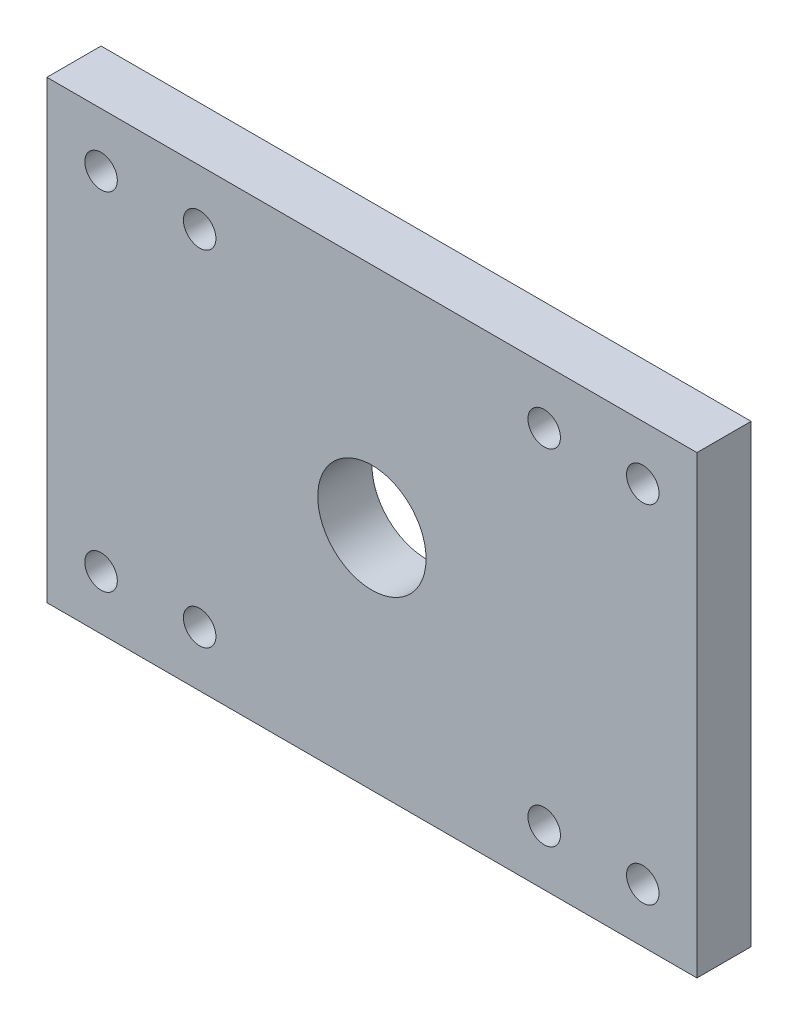
ISO-10303-21;
HEADER;
FILE_DESCRIPTION(('STEP AP214'),'2;1');
FILE_NAME('part.step','',(''),(''),'','','');
FILE_SCHEMA(('AUTOMOTIVE_DESIGN { 1 0 10303 214 1 1 1 1 }'));
ENDSEC;
DATA;
#1=APPLICATION_CONTEXT('core data for automotive mechanical design processes');
#2=APPLICATION_PROTOCOL_DEFINITION('international standard','automotive_design',2000,#1);
#3=PRODUCT_CONTEXT('',#1,'mechanical');
#4=PRODUCT('Part','Part','',(#3));
#5=PRODUCT_RELATED_PRODUCT_CATEGORY('part','',(#4));
#6=PRODUCT_DEFINITION_FORMATION('','',#4);
#7=PRODUCT_DEFINITION_CONTEXT('part definition',#1,'design');
#8=PRODUCT_DEFINITION('design','',#6,#7);
#9=PRODUCT_DEFINITION_SHAPE('','',#8);
#10=(LENGTH_UNIT() NAMED_UNIT(*) SI_UNIT(.MILLI.,.METRE.));
#11=(NAMED_UNIT(*) PLANE_ANGLE_UNIT() SI_UNIT($,.RADIAN.));
#12=(NAMED_UNIT(*) SI_UNIT($,.STERADIAN.) SOLID_ANGLE_UNIT());
#13=UNCERTAINTY_MEASURE_WITH_UNIT(LENGTH_MEASURE(1.E-05),#10,'distance_accuracy_value','');
#14=(GEOMETRIC_REPRESENTATION_CONTEXT(3) GLOBAL_UNCERTAINTY_ASSIGNED_CONTEXT((#13)) GLOBAL_UNIT_ASSIGNED_CONTEXT((#10,
#11,#12)) REPRESENTATION_CONTEXT('',''));
#15=CARTESIAN_POINT('',(0.,0.,0.));
#16=DIRECTION('',(0.,0.,1.));
#17=DIRECTION('',(1.,0.,0.));
#18=AXIS2_PLACEMENT_3D('',#15,#16,#17);
#19=CARTESIAN_POINT('',(-15.9,15.9,5.));
#20=DIRECTION('',(0.,0.,-1.));
#21=DIRECTION('',(-1.,0.,0.));
#22=AXIS2_PLACEMENT_3D('',#19,#20,#21);
#23=CYLINDRICAL_SURFACE('',#22,1.5);
#24=CARTESIAN_POINT('',(-15.9,15.9,5.));
#25=DIRECTION('',(0.,0.,1.));
#26=DIRECTION('',(1.,0.,0.));
#27=AXIS2_PLACEMENT_3D('',#24,#25,#26);
#28=CIRCLE('',#27,1.5);
#29=CARTESIAN_POINT('',(-14.4,15.9,5.));
#30=VERTEX_POINT('',#29);
#31=EDGE_CURVE('E197',#30,#30,#28,.T.);
#32=ORIENTED_EDGE('',*,*,#31,.T.);
#33=EDGE_LOOP('',(#32));
#34=FACE_BOUND('',#33,.T.);
#35=CARTESIAN_POINT('',(-15.9,15.9,2.5));
#36=DIRECTION('',(0.,0.,-1.));
#37=DIRECTION('',(-1.,0.,0.));
#38=AXIS2_PLACEMENT_3D('',#35,#36,#37);
#39=CIRCLE('',#38,1.5);
#40=CARTESIAN_POINT('',(-17.4,15.9,2.5));
#41=VERTEX_POINT('',#40);
#42=EDGE_CURVE('E45',#41,#41,#39,.T.);
#43=ORIENTED_EDGE('',*,*,#42,.T.);
#44=EDGE_LOOP('',(#43));
#45=FACE_BOUND('',#44,.T.);
#46=ADVANCED_FACE('F41',(#34,#45),#23,.F.);
#47=CARTESIAN_POINT('',(15.9000000000001,15.9,5.));
#48=DIRECTION('',(0.,0.,-1.));
#49=DIRECTION('',(-1.,0.,0.));
#50=AXIS2_PLACEMENT_3D('',#47,#48,#49);
#51=CYLINDRICAL_SURFACE('',#50,1.5);
#52=CARTESIAN_POINT('',(15.9000000000001,15.9,5.));
#53=DIRECTION('',(0.,0.,1.));
#54=DIRECTION('',(1.,0.,0.));
#55=AXIS2_PLACEMENT_3D('',#52,#53,#54);
#56=CIRCLE('',#55,1.5);
#57=CARTESIAN_POINT('',(17.4000000000001,15.9,5.));
#58=VERTEX_POINT('',#57);
#59=EDGE_CURVE('E191',#58,#58,#56,.T.);
#60=ORIENTED_EDGE('',*,*,#59,.T.);
#61=EDGE_LOOP('',(#60));
#62=FACE_BOUND('',#61,.T.);
#63=CARTESIAN_POINT('',(15.9000000000001,15.9,2.5));
#64=DIRECTION('',(0.,0.,-1.));
#65=DIRECTION('',(-1.,0.,0.));
#66=AXIS2_PLACEMENT_3D('',#63,#64,#65);
#67=CIRCLE('',#66,1.5);
#68=CARTESIAN_POINT('',(14.4000000000001,15.9,2.5));
#69=VERTEX_POINT('',#68);
#70=EDGE_CURVE('E146',#69,#69,#67,.T.);
#71=ORIENTED_EDGE('',*,*,#70,.T.);
#72=EDGE_LOOP('',(#71));
#73=FACE_BOUND('',#72,.T.);
#74=ADVANCED_FACE('F230',(#62,#73),#51,.F.);
#75=CARTESIAN_POINT('',(-15.9000000000002,-15.8999999999998,5.));
#76=DIRECTION('',(0.,0.,-1.));
#77=DIRECTION('',(-1.,0.,0.));
#78=AXIS2_PLACEMENT_3D('',#75,#76,#77);
#79=CYLINDRICAL_SURFACE('',#78,1.5);
#80=CARTESIAN_POINT('',(-15.9000000000002,-15.8999999999998,5.));
#81=DIRECTION('',(0.,0.,1.));
#82=DIRECTION('',(1.,0.,0.));
#83=AXIS2_PLACEMENT_3D('',#80,#81,#82);
#84=CIRCLE('',#83,1.5);
#85=CARTESIAN_POINT('',(-14.4000000000002,-15.8999999999998,5.));
#86=VERTEX_POINT('',#85);
#87=EDGE_CURVE('E188',#86,#86,#84,.T.);
#88=ORIENTED_EDGE('',*,*,#87,.T.);
#89=EDGE_LOOP('',(#88));
#90=FACE_BOUND('',#89,.T.);
#91=CARTESIAN_POINT('',(-15.9000000000002,-15.8999999999998,2.5));
#92=DIRECTION('',(0.,0.,-1.));
#93=DIRECTION('',(-1.,0.,0.));
#94=AXIS2_PLACEMENT_3D('',#91,#92,#93);
#95=CIRCLE('',#94,1.5);
#96=CARTESIAN_POINT('',(-17.4000000000002,-15.8999999999998,2.5));
#97=VERTEX_POINT('',#96);
#98=EDGE_CURVE('E143',#97,#97,#95,.T.);
#99=ORIENTED_EDGE('',*,*,#98,.T.);
#100=EDGE_LOOP('',(#99));
#101=FACE_BOUND('',#100,.T.);
#102=ADVANCED_FACE('F236',(#90,#101),#79,.F.);
#103=CARTESIAN_POINT('',(15.8999999999999,-15.9000000000001,5.));
#104=DIRECTION('',(0.,0.,-1.));
#105=DIRECTION('',(-1.,0.,0.));
#106=AXIS2_PLACEMENT_3D('',#103,#104,#105);
#107=CYLINDRICAL_SURFACE('',#106,1.5);
#108=CARTESIAN_POINT('',(15.8999999999999,-15.9000000000001,5.));
#109=DIRECTION('',(0.,0.,1.));
#110=DIRECTION('',(1.,0.,0.));
#111=AXIS2_PLACEMENT_3D('',#108,#109,#110);
#112=CIRCLE('',#111,1.5);
#113=CARTESIAN_POINT('',(17.3999999999999,-15.9000000000001,5.));
#114=VERTEX_POINT('',#113);
#115=EDGE_CURVE('E137',#114,#114,#112,.T.);
#116=ORIENTED_EDGE('',*,*,#115,.T.);
#117=EDGE_LOOP('',(#116));
#118=FACE_BOUND('',#117,.T.);
#119=CARTESIAN_POINT('',(15.8999999999999,-15.9000000000001,2.5));
#120=DIRECTION('',(0.,0.,-1.));
#121=DIRECTION('',(-1.,0.,0.));
#122=AXIS2_PLACEMENT_3D('',#119,#120,#121);
#123=CIRCLE('',#122,1.5);
#124=CARTESIAN_POINT('',(14.3999999999999,-15.9000000000001,2.5));
#125=VERTEX_POINT('',#124);
#126=EDGE_CURVE('E140',#125,#125,#123,.T.);
#127=ORIENTED_EDGE('',*,*,#126,.T.);
#128=EDGE_LOOP('',(#127));
#129=FACE_BOUND('',#128,.T.);
#130=ADVANCED_FACE('F43',(#118,#129),#107,.F.);
#131=CARTESIAN_POINT('',(30.,0.,5.));
#132=DIRECTION('',(1.,0.,0.));
#133=DIRECTION('',(0.,1.,0.));
#134=AXIS2_PLACEMENT_3D('',#131,#132,#133);
#135=PLANE('',#134);
#136=DIRECTION('',(0.,-1.,0.));
#137=VECTOR('',#136,1.);
#138=CARTESIAN_POINT('',(30.,0.,0.));
#139=LINE('',#138,#137);
#140=CARTESIAN_POINT('',(30.,21.,0.));
#141=VERTEX_POINT('',#140);
#142=CARTESIAN_POINT('',(30.,-21.,0.));
#143=VERTEX_POINT('',#142);
#144=EDGE_CURVE('E128',#141,#143,#139,.T.);
#145=ORIENTED_EDGE('',*,*,#144,.F.);
#146=DIRECTION('',(0.,0.,-1.));
#147=VECTOR('',#146,1.);
#148=CARTESIAN_POINT('',(30.,21.,5.));
#149=LINE('',#148,#147);
#150=CARTESIAN_POINT('',(30.,21.,5.));
#151=VERTEX_POINT('',#150);
#152=EDGE_CURVE('E11',#151,#141,#149,.T.);
#153=ORIENTED_EDGE('',*,*,#152,.F.);
#154=DIRECTION('',(0.,-1.,0.));
#155=VECTOR('',#154,1.);
#156=CARTESIAN_POINT('',(30.,0.,5.));
#157=LINE('',#156,#155);
#158=CARTESIAN_POINT('',(30.,-21.,5.));
#159=VERTEX_POINT('',#158);
#160=EDGE_CURVE('E106',#151,#159,#157,.T.);
#161=ORIENTED_EDGE('',*,*,#160,.T.);
#162=DIRECTION('',(0.,0.,-1.));
#163=VECTOR('',#162,1.);
#164=CARTESIAN_POINT('',(30.,-21.,5.));
#165=LINE('',#164,#163);
#166=EDGE_CURVE('E83',#159,#143,#165,.T.);
#167=ORIENTED_EDGE('',*,*,#166,.T.);
#168=EDGE_LOOP('',(#145,#153,#161,#167));
#169=FACE_BOUND('',#168,.T.);
#170=ADVANCED_FACE('F250',(#169),#135,.T.);
#171=CARTESIAN_POINT('',(0.,21.,5.));
#172=DIRECTION('',(0.,1.,0.));
#173=DIRECTION('',(0.,0.,1.));
#174=AXIS2_PLACEMENT_3D('',#171,#172,#173);
#175=PLANE('',#174);
#176=DIRECTION('',(1.,0.,0.));
#177=VECTOR('',#176,1.);
#178=CARTESIAN_POINT('',(0.,21.,0.));
#179=LINE('',#178,#177);
#180=CARTESIAN_POINT('',(-30.,21.,0.));
#181=VERTEX_POINT('',#180);
#182=EDGE_CURVE('E95',#181,#141,#179,.T.);
#183=ORIENTED_EDGE('',*,*,#182,.F.);
#184=DIRECTION('',(0.,0.,-1.));
#185=VECTOR('',#184,1.);
#186=CARTESIAN_POINT('',(-30.,21.,5.));
#187=LINE('',#186,#185);
#188=CARTESIAN_POINT('',(-30.,21.,5.));
#189=VERTEX_POINT('',#188);
#190=EDGE_CURVE('E51',#189,#181,#187,.T.);
#191=ORIENTED_EDGE('',*,*,#190,.F.);
#192=DIRECTION('',(1.,0.,0.));
#193=VECTOR('',#192,1.);
#194=CARTESIAN_POINT('',(0.,21.,5.));
#195=LINE('',#194,#193);
#196=EDGE_CURVE('E93',#189,#151,#195,.T.);
#197=ORIENTED_EDGE('',*,*,#196,.T.);
#198=ORIENTED_EDGE('',*,*,#152,.T.);
#199=EDGE_LOOP('',(#183,#191,#197,#198));
#200=FACE_BOUND('',#199,.T.);
#201=ADVANCED_FACE('F91',(#200),#175,.T.);
#202=CARTESIAN_POINT('',(-30.,0.,5.));
#203=DIRECTION('',(1.,0.,0.));
#204=DIRECTION('',(0.,1.,0.));
#205=AXIS2_PLACEMENT_3D('',#202,#203,#204);
#206=PLANE('',#205);
#207=DIRECTION('',(0.,-1.,0.));
#208=VECTOR('',#207,1.);
#209=CARTESIAN_POINT('',(-30.,0.,0.));
#210=LINE('',#209,#208);
#211=CARTESIAN_POINT('',(-30.,-21.,0.));
#212=VERTEX_POINT('',#211);
#213=EDGE_CURVE('E131',#181,#212,#210,.T.);
#214=ORIENTED_EDGE('',*,*,#213,.T.);
#215=DIRECTION('',(0.,0.,-1.));
#216=VECTOR('',#215,1.);
#217=CARTESIAN_POINT('',(-30.,-21.,5.));
#218=LINE('',#217,#216);
#219=CARTESIAN_POINT('',(-30.,-21.,5.));
#220=VERTEX_POINT('',#219);
#221=EDGE_CURVE('E98',#220,#212,#218,.T.);
#222=ORIENTED_EDGE('',*,*,#221,.F.);
#223=DIRECTION('',(0.,-1.,0.));
#224=VECTOR('',#223,1.);
#225=CARTESIAN_POINT('',(-30.,0.,5.));
#226=LINE('',#225,#224);
#227=EDGE_CURVE('E101',#189,#220,#226,.T.);
#228=ORIENTED_EDGE('',*,*,#227,.F.);
#229=ORIENTED_EDGE('',*,*,#190,.T.);
#230=EDGE_LOOP('',(#214,#222,#228,#229));
#231=FACE_BOUND('',#230,.T.);
#232=ADVANCED_FACE('F102',(#231),#206,.F.);
#233=CARTESIAN_POINT('',(0.,-21.,5.));
#234=DIRECTION('',(0.,1.,0.));
#235=DIRECTION('',(0.,0.,1.));
#236=AXIS2_PLACEMENT_3D('',#233,#234,#235);
#237=PLANE('',#236);
#238=DIRECTION('',(1.,0.,0.));
#239=VECTOR('',#238,1.);
#240=CARTESIAN_POINT('',(0.,-21.,0.));
#241=LINE('',#240,#239);
#242=EDGE_CURVE('E76',#212,#143,#241,.T.);
#243=ORIENTED_EDGE('',*,*,#242,.T.);
#244=ORIENTED_EDGE('',*,*,#166,.F.);
#245=DIRECTION('',(1.,0.,0.));
#246=VECTOR('',#245,1.);
#247=CARTESIAN_POINT('',(0.,-21.,5.));
#248=LINE('',#247,#246);
#249=EDGE_CURVE('E60',#220,#159,#248,.T.);
#250=ORIENTED_EDGE('',*,*,#249,.F.);
#251=ORIENTED_EDGE('',*,*,#221,.T.);
#252=EDGE_LOOP('',(#243,#244,#250,#251));
#253=FACE_BOUND('',#252,.T.);
#254=ADVANCED_FACE('F293',(#253),#237,.F.);
#255=CARTESIAN_POINT('',(-25.,16.,5.));
#256=DIRECTION('',(0.,0.,-1.));
#257=DIRECTION('',(-1.,0.,0.));
#258=AXIS2_PLACEMENT_3D('',#255,#256,#257);
#259=CYLINDRICAL_SURFACE('',#258,1.5);
#260=CARTESIAN_POINT('',(-25.,16.,5.));
#261=DIRECTION('',(0.,0.,1.));
#262=DIRECTION('',(1.,0.,0.));
#263=AXIS2_PLACEMENT_3D('',#260,#261,#262);
#264=CIRCLE('',#263,1.5);
#265=CARTESIAN_POINT('',(-23.5,16.,5.));
#266=VERTEX_POINT('',#265);
#267=EDGE_CURVE('E108',#266,#266,#264,.T.);
#268=ORIENTED_EDGE('',*,*,#267,.T.);
#269=EDGE_LOOP('',(#268));
#270=FACE_BOUND('',#269,.T.);
#271=CARTESIAN_POINT('',(-25.,16.,0.));
#272=DIRECTION('',(0.,0.,1.));
#273=DIRECTION('',(1.,0.,0.));
#274=AXIS2_PLACEMENT_3D('',#271,#272,#273);
#275=CIRCLE('',#274,1.5);
#276=CARTESIAN_POINT('',(-23.5,16.,0.));
#277=VERTEX_POINT('',#276);
#278=EDGE_CURVE('E125',#277,#277,#275,.T.);
#279=ORIENTED_EDGE('',*,*,#278,.F.);
#280=EDGE_LOOP('',(#279));
#281=FACE_BOUND('',#280,.T.);
#282=ADVANCED_FACE('F208',(#270,#281),#259,.F.);
#283=CARTESIAN_POINT('',(-25.,-16.,5.));
#284=DIRECTION('',(0.,0.,-1.));
#285=DIRECTION('',(-1.,0.,0.));
#286=AXIS2_PLACEMENT_3D('',#283,#284,#285);
#287=CYLINDRICAL_SURFACE('',#286,1.5);
#288=CARTESIAN_POINT('',(-25.,-16.,5.));
#289=DIRECTION('',(0.,0.,1.));
#290=DIRECTION('',(1.,0.,0.));
#291=AXIS2_PLACEMENT_3D('',#288,#289,#290);
#292=CIRCLE('',#291,1.5);
#293=CARTESIAN_POINT('',(-23.5,-16.,5.));
#294=VERTEX_POINT('',#293);
#295=EDGE_CURVE('E203',#294,#294,#292,.T.);
#296=ORIENTED_EDGE('',*,*,#295,.T.);
#297=EDGE_LOOP('',(#296));
#298=FACE_BOUND('',#297,.T.);
#299=CARTESIAN_POINT('',(-25.,-16.,0.));
#300=DIRECTION('',(0.,0.,1.));
#301=DIRECTION('',(1.,0.,0.));
#302=AXIS2_PLACEMENT_3D('',#299,#300,#301);
#303=CIRCLE('',#302,1.5);
#304=CARTESIAN_POINT('',(-23.5,-16.,0.));
#305=VERTEX_POINT('',#304);
#306=EDGE_CURVE('E122',#305,#305,#303,.T.);
#307=ORIENTED_EDGE('',*,*,#306,.F.);
#308=EDGE_LOOP('',(#307));
#309=FACE_BOUND('',#308,.T.);
#310=ADVANCED_FACE('F292',(#298,#309),#287,.F.);
#311=CARTESIAN_POINT('',(25.,-16.,5.));
#312=DIRECTION('',(0.,0.,-1.));
#313=DIRECTION('',(-1.,0.,0.));
#314=AXIS2_PLACEMENT_3D('',#311,#312,#313);
#315=CYLINDRICAL_SURFACE('',#314,1.5);
#316=CARTESIAN_POINT('',(25.,-16.,5.));
#317=DIRECTION('',(0.,0.,1.));
#318=DIRECTION('',(1.,0.,0.));
#319=AXIS2_PLACEMENT_3D('',#316,#317,#318);
#320=CIRCLE('',#319,1.5);
#321=CARTESIAN_POINT('',(26.5,-16.,5.));
#322=VERTEX_POINT('',#321);
#323=EDGE_CURVE('E200',#322,#322,#320,.T.);
#324=ORIENTED_EDGE('',*,*,#323,.T.);
#325=EDGE_LOOP('',(#324));
#326=FACE_BOUND('',#325,.T.);
#327=CARTESIAN_POINT('',(25.,-16.,0.));
#328=DIRECTION('',(0.,0.,1.));
#329=DIRECTION('',(1.,0.,0.));
#330=AXIS2_PLACEMENT_3D('',#327,#328,#329);
#331=CIRCLE('',#330,1.5);
#332=CARTESIAN_POINT('',(26.5,-16.,0.));
#333=VERTEX_POINT('',#332);
#334=EDGE_CURVE('E119',#333,#333,#331,.T.);
#335=ORIENTED_EDGE('',*,*,#334,.F.);
#336=EDGE_LOOP('',(#335));
#337=FACE_BOUND('',#336,.T.);
#338=ADVANCED_FACE('F241',(#326,#337),#315,.F.);
#339=CARTESIAN_POINT('',(25.,16.,5.));
#340=DIRECTION('',(0.,0.,-1.));
#341=DIRECTION('',(-1.,0.,0.));
#342=AXIS2_PLACEMENT_3D('',#339,#340,#341);
#343=CYLINDRICAL_SURFACE('',#342,1.5);
#344=CARTESIAN_POINT('',(25.,16.,5.));
#345=DIRECTION('',(0.,0.,1.));
#346=DIRECTION('',(1.,0.,0.));
#347=AXIS2_PLACEMENT_3D('',#344,#345,#346);
#348=CIRCLE('',#347,1.5);
#349=CARTESIAN_POINT('',(26.5,16.,5.));
#350=VERTEX_POINT('',#349);
#351=EDGE_CURVE('E194',#350,#350,#348,.T.);
#352=ORIENTED_EDGE('',*,*,#351,.T.);
#353=EDGE_LOOP('',(#352));
#354=FACE_BOUND('',#353,.T.);
#355=CARTESIAN_POINT('',(25.,16.,0.));
#356=DIRECTION('',(0.,0.,1.));
#357=DIRECTION('',(1.,0.,0.));
#358=AXIS2_PLACEMENT_3D('',#355,#356,#357);
#359=CIRCLE('',#358,1.5);
#360=CARTESIAN_POINT('',(26.5,16.,0.));
#361=VERTEX_POINT('',#360);
#362=EDGE_CURVE('E116',#361,#361,#359,.T.);
#363=ORIENTED_EDGE('',*,*,#362,.F.);
#364=EDGE_LOOP('',(#363));
#365=FACE_BOUND('',#364,.T.);
#366=ADVANCED_FACE('F224',(#354,#365),#343,.F.);
#367=CARTESIAN_POINT('',(0.,0.,5.));
#368=DIRECTION('',(0.,0.,-1.));
#369=DIRECTION('',(-1.,0.,0.));
#370=AXIS2_PLACEMENT_3D('',#367,#368,#369);
#371=CYLINDRICAL_SURFACE('',#370,5.);
#372=CARTESIAN_POINT('',(0.,0.,5.));
#373=DIRECTION('',(0.,0.,1.));
#374=DIRECTION('',(1.,0.,0.));
#375=AXIS2_PLACEMENT_3D('',#372,#373,#374);
#376=CIRCLE('',#375,5.);
#377=CARTESIAN_POINT('',(4.99999999999998,0.,5.));
#378=VERTEX_POINT('',#377);
#379=EDGE_CURVE('E113',#378,#378,#376,.T.);
#380=ORIENTED_EDGE('',*,*,#379,.T.);
#381=EDGE_LOOP('',(#380));
#382=FACE_BOUND('',#381,.T.);
#383=CARTESIAN_POINT('',(0.,0.,0.));
#384=DIRECTION('',(0.,0.,1.));
#385=DIRECTION('',(1.,0.,0.));
#386=AXIS2_PLACEMENT_3D('',#383,#384,#385);
#387=CIRCLE('',#386,5.);
#388=CARTESIAN_POINT('',(4.99999999999998,0.,0.));
#389=VERTEX_POINT('',#388);
#390=EDGE_CURVE('E134',#389,#389,#387,.T.);
#391=ORIENTED_EDGE('',*,*,#390,.F.);
#392=EDGE_LOOP('',(#391));
#393=FACE_BOUND('',#392,.T.);
#394=ADVANCED_FACE('F213',(#382,#393),#371,.F.);
#395=CARTESIAN_POINT('',(0.,0.,5.));
#396=DIRECTION('',(0.,0.,1.));
#397=DIRECTION('',(1.,0.,0.));
#398=AXIS2_PLACEMENT_3D('',#395,#396,#397);
#399=PLANE('',#398);
#400=ORIENTED_EDGE('',*,*,#115,.F.);
#401=EDGE_LOOP('',(#400));
#402=FACE_BOUND('',#401,.T.);
#403=ORIENTED_EDGE('',*,*,#87,.F.);
#404=EDGE_LOOP('',(#403));
#405=FACE_BOUND('',#404,.T.);
#406=ORIENTED_EDGE('',*,*,#59,.F.);
#407=EDGE_LOOP('',(#406));
#408=FACE_BOUND('',#407,.T.);
#409=ORIENTED_EDGE('',*,*,#351,.F.);
#410=EDGE_LOOP('',(#409));
#411=FACE_BOUND('',#410,.T.);
#412=ORIENTED_EDGE('',*,*,#31,.F.);
#413=EDGE_LOOP('',(#412));
#414=FACE_BOUND('',#413,.T.);
#415=ORIENTED_EDGE('',*,*,#323,.F.);
#416=EDGE_LOOP('',(#415));
#417=FACE_BOUND('',#416,.T.);
#418=ORIENTED_EDGE('',*,*,#295,.F.);
#419=EDGE_LOOP('',(#418));
#420=FACE_BOUND('',#419,.T.);
#421=ORIENTED_EDGE('',*,*,#267,.F.);
#422=EDGE_LOOP('',(#421));
#423=FACE_BOUND('',#422,.T.);
#424=ORIENTED_EDGE('',*,*,#160,.F.);
#425=ORIENTED_EDGE('',*,*,#196,.F.);
#426=ORIENTED_EDGE('',*,*,#227,.T.);
#427=ORIENTED_EDGE('',*,*,#249,.T.);
#428=EDGE_LOOP('',(#424,#425,#426,#427));
#429=FACE_BOUND('',#428,.T.);
#430=ORIENTED_EDGE('',*,*,#379,.F.);
#431=EDGE_LOOP('',(#430));
#432=FACE_BOUND('',#431,.T.);
#433=ADVANCED_FACE('F104',(#402,#405,#408,#411,#414,#417,#420,#423,#429,#432),#399,.T.);
#434=CARTESIAN_POINT('',(0.,0.,0.));
#435=DIRECTION('',(0.,0.,1.));
#436=DIRECTION('',(1.,0.,0.));
#437=AXIS2_PLACEMENT_3D('',#434,#435,#436);
#438=PLANE('',#437);
#439=CARTESIAN_POINT('',(15.9000000000001,-15.8999999999999,0.));
#440=DIRECTION('',(0.,0.,-1.));
#441=DIRECTION('',(-1.,0.,0.));
#442=AXIS2_PLACEMENT_3D('',#439,#440,#441);
#443=CIRCLE('',#442,2.625);
#444=CARTESIAN_POINT('',(13.2750000000001,-15.8999999999999,0.));
#445=VERTEX_POINT('',#444);
#446=EDGE_CURVE('E176',#445,#445,#443,.T.);
#447=ORIENTED_EDGE('',*,*,#446,.F.);
#448=EDGE_LOOP('',(#447));
#449=FACE_BOUND('',#448,.T.);
#450=CARTESIAN_POINT('',(-15.9,-15.9000000000001,0.));
#451=DIRECTION('',(0.,0.,-1.));
#452=DIRECTION('',(-1.,0.,0.));
#453=AXIS2_PLACEMENT_3D('',#450,#451,#452);
#454=CIRCLE('',#453,2.625);
#455=CARTESIAN_POINT('',(-18.525,-15.9000000000001,0.));
#456=VERTEX_POINT('',#455);
#457=EDGE_CURVE('E165',#456,#456,#454,.T.);
#458=ORIENTED_EDGE('',*,*,#457,.F.);
#459=EDGE_LOOP('',(#458));
#460=FACE_BOUND('',#459,.T.);
#461=CARTESIAN_POINT('',(-15.9,15.9,0.));
#462=DIRECTION('',(0.,0.,-1.));
#463=DIRECTION('',(-1.,0.,0.));
#464=AXIS2_PLACEMENT_3D('',#461,#462,#463);
#465=CIRCLE('',#464,2.625);
#466=CARTESIAN_POINT('',(-18.525,15.9,0.));
#467=VERTEX_POINT('',#466);
#468=EDGE_CURVE('E164',#467,#467,#465,.T.);
#469=ORIENTED_EDGE('',*,*,#468,.F.);
#470=EDGE_LOOP('',(#469));
#471=FACE_BOUND('',#470,.T.);
#472=CARTESIAN_POINT('',(15.9000000000001,15.9,0.));
#473=DIRECTION('',(0.,0.,-1.));
#474=DIRECTION('',(-1.,0.,0.));
#475=AXIS2_PLACEMENT_3D('',#472,#473,#474);
#476=CIRCLE('',#475,2.625);
#477=CARTESIAN_POINT('',(13.2750000000001,15.9,0.));
#478=VERTEX_POINT('',#477);
#479=EDGE_CURVE('E168',#478,#478,#476,.T.);
#480=ORIENTED_EDGE('',*,*,#479,.F.);
#481=EDGE_LOOP('',(#480));
#482=FACE_BOUND('',#481,.T.);
#483=ORIENTED_EDGE('',*,*,#362,.T.);
#484=EDGE_LOOP('',(#483));
#485=FACE_BOUND('',#484,.T.);
#486=ORIENTED_EDGE('',*,*,#334,.T.);
#487=EDGE_LOOP('',(#486));
#488=FACE_BOUND('',#487,.T.);
#489=ORIENTED_EDGE('',*,*,#306,.T.);
#490=EDGE_LOOP('',(#489));
#491=FACE_BOUND('',#490,.T.);
#492=ORIENTED_EDGE('',*,*,#278,.T.);
#493=EDGE_LOOP('',(#492));
#494=FACE_BOUND('',#493,.T.);
#495=ORIENTED_EDGE('',*,*,#144,.T.);
#496=ORIENTED_EDGE('',*,*,#242,.F.);
#497=ORIENTED_EDGE('',*,*,#213,.F.);
#498=ORIENTED_EDGE('',*,*,#182,.T.);
#499=EDGE_LOOP('',(#495,#496,#497,#498));
#500=FACE_BOUND('',#499,.T.);
#501=ORIENTED_EDGE('',*,*,#390,.T.);
#502=EDGE_LOOP('',(#501));
#503=FACE_BOUND('',#502,.T.);
#504=ADVANCED_FACE('F212',(#449,#460,#471,#482,#485,#488,#491,#494,#500,#503),#438,.F.);
#505=CARTESIAN_POINT('',(15.9000000000001,15.9,2.5));
#506=DIRECTION('',(0.,0.,-1.));
#507=DIRECTION('',(-1.,0.,0.));
#508=AXIS2_PLACEMENT_3D('',#505,#506,#507);
#509=CYLINDRICAL_SURFACE('',#508,2.625);
#510=CARTESIAN_POINT('',(15.9000000000001,15.9,2.5));
#511=DIRECTION('',(0.,0.,-1.));
#512=DIRECTION('',(-1.,0.,0.));
#513=AXIS2_PLACEMENT_3D('',#510,#511,#512);
#514=CIRCLE('',#513,2.625);
#515=CARTESIAN_POINT('',(13.2750000000001,15.9,2.5));
#516=VERTEX_POINT('',#515);
#517=EDGE_CURVE('E144',#516,#516,#514,.T.);
#518=ORIENTED_EDGE('',*,*,#517,.F.);
#519=EDGE_LOOP('',(#518));
#520=FACE_BOUND('',#519,.T.);
#521=ORIENTED_EDGE('',*,*,#479,.T.);
#522=EDGE_LOOP('',(#521));
#523=FACE_BOUND('',#522,.T.);
#524=ADVANCED_FACE('F221',(#520,#523),#509,.F.);
#525=CARTESIAN_POINT('',(15.9000000000001,15.9,2.5));
#526=DIRECTION('',(0.,0.,-1.));
#527=DIRECTION('',(-1.,0.,0.));
#528=AXIS2_PLACEMENT_3D('',#525,#526,#527);
#529=PLANE('',#528);
#530=ORIENTED_EDGE('',*,*,#70,.F.);
#531=EDGE_LOOP('',(#530));
#532=FACE_BOUND('',#531,.T.);
#533=ORIENTED_EDGE('',*,*,#517,.T.);
#534=EDGE_LOOP('',(#533));
#535=FACE_BOUND('',#534,.T.);
#536=ADVANCED_FACE('F386',(#532,#535),#529,.T.);
#537=CARTESIAN_POINT('',(-15.9,15.9,2.5));
#538=DIRECTION('',(0.,0.,-1.));
#539=DIRECTION('',(-1.,0.,0.));
#540=AXIS2_PLACEMENT_3D('',#537,#538,#539);
#541=CYLINDRICAL_SURFACE('',#540,2.625);
#542=CARTESIAN_POINT('',(-15.9,15.9,2.5));
#543=DIRECTION('',(0.,0.,-1.));
#544=DIRECTION('',(-1.,0.,0.));
#545=AXIS2_PLACEMENT_3D('',#542,#543,#544);
#546=CIRCLE('',#545,2.625);
#547=CARTESIAN_POINT('',(-18.525,15.9,2.5));
#548=VERTEX_POINT('',#547);
#549=EDGE_CURVE('E162',#548,#548,#546,.T.);
#550=ORIENTED_EDGE('',*,*,#549,.F.);
#551=EDGE_LOOP('',(#550));
#552=FACE_BOUND('',#551,.T.);
#553=ORIENTED_EDGE('',*,*,#468,.T.);
#554=EDGE_LOOP('',(#553));
#555=FACE_BOUND('',#554,.T.);
#556=ADVANCED_FACE('F158',(#552,#555),#541,.F.);
#557=CARTESIAN_POINT('',(-15.9,15.9,2.5));
#558=DIRECTION('',(0.,0.,-1.));
#559=DIRECTION('',(-1.,0.,0.));
#560=AXIS2_PLACEMENT_3D('',#557,#558,#559);
#561=PLANE('',#560);
#562=ORIENTED_EDGE('',*,*,#42,.F.);
#563=EDGE_LOOP('',(#562));
#564=FACE_BOUND('',#563,.T.);
#565=ORIENTED_EDGE('',*,*,#549,.T.);
#566=EDGE_LOOP('',(#565));
#567=FACE_BOUND('',#566,.T.);
#568=ADVANCED_FACE('F154',(#564,#567),#561,.T.);
#569=CARTESIAN_POINT('',(-15.9,-15.9000000000001,2.5));
#570=DIRECTION('',(0.,0.,-1.));
#571=DIRECTION('',(-1.,0.,0.));
#572=AXIS2_PLACEMENT_3D('',#569,#570,#571);
#573=CYLINDRICAL_SURFACE('',#572,2.625);
#574=CARTESIAN_POINT('',(-15.9,-15.9000000000001,2.5));
#575=DIRECTION('',(0.,0.,-1.));
#576=DIRECTION('',(-1.,0.,0.));
#577=AXIS2_PLACEMENT_3D('',#574,#575,#576);
#578=CIRCLE('',#577,2.625);
#579=CARTESIAN_POINT('',(-18.525,-15.9000000000001,2.5));
#580=VERTEX_POINT('',#579);
#581=EDGE_CURVE('E171',#580,#580,#578,.T.);
#582=ORIENTED_EDGE('',*,*,#581,.F.);
#583=EDGE_LOOP('',(#582));
#584=FACE_BOUND('',#583,.T.);
#585=ORIENTED_EDGE('',*,*,#457,.T.);
#586=EDGE_LOOP('',(#585));
#587=FACE_BOUND('',#586,.T.);
#588=ADVANCED_FACE('F157',(#584,#587),#573,.F.);
#589=CARTESIAN_POINT('',(-15.9,-15.9000000000001,2.5));
#590=DIRECTION('',(0.,0.,-1.));
#591=DIRECTION('',(-1.,0.,0.));
#592=AXIS2_PLACEMENT_3D('',#589,#590,#591);
#593=PLANE('',#592);
#594=ORIENTED_EDGE('',*,*,#98,.F.);
#595=EDGE_LOOP('',(#594));
#596=FACE_BOUND('',#595,.T.);
#597=ORIENTED_EDGE('',*,*,#581,.T.);
#598=EDGE_LOOP('',(#597));
#599=FACE_BOUND('',#598,.T.);
#600=ADVANCED_FACE('F256',(#596,#599),#593,.T.);
#601=CARTESIAN_POINT('',(15.9000000000001,-15.8999999999999,2.5));
#602=DIRECTION('',(0.,0.,-1.));
#603=DIRECTION('',(-1.,0.,0.));
#604=AXIS2_PLACEMENT_3D('',#601,#602,#603);
#605=CYLINDRICAL_SURFACE('',#604,2.625);
#606=CARTESIAN_POINT('',(15.9000000000001,-15.8999999999999,2.5));
#607=DIRECTION('',(0.,0.,-1.));
#608=DIRECTION('',(-1.,0.,0.));
#609=AXIS2_PLACEMENT_3D('',#606,#607,#608);
#610=CIRCLE('',#609,2.625);
#611=CARTESIAN_POINT('',(13.2750000000001,-15.8999999999999,2.5));
#612=VERTEX_POINT('',#611);
#613=EDGE_CURVE('E179',#612,#612,#610,.T.);
#614=ORIENTED_EDGE('',*,*,#613,.F.);
#615=EDGE_LOOP('',(#614));
#616=FACE_BOUND('',#615,.T.);
#617=ORIENTED_EDGE('',*,*,#446,.T.);
#618=EDGE_LOOP('',(#617));
#619=FACE_BOUND('',#618,.T.);
#620=ADVANCED_FACE('F259',(#616,#619),#605,.F.);
#621=CARTESIAN_POINT('',(15.9000000000001,-15.8999999999999,2.5));
#622=DIRECTION('',(0.,0.,-1.));
#623=DIRECTION('',(-1.,0.,0.));
#624=AXIS2_PLACEMENT_3D('',#621,#622,#623);
#625=PLANE('',#624);
#626=ORIENTED_EDGE('',*,*,#126,.F.);
#627=EDGE_LOOP('',(#626));
#628=FACE_BOUND('',#627,.T.);
#629=ORIENTED_EDGE('',*,*,#613,.T.);
#630=EDGE_LOOP('',(#629));
#631=FACE_BOUND('',#630,.T.);
#632=ADVANCED_FACE('F430',(#628,#631),#625,.T.);
#633=CLOSED_SHELL('',(#46,#74,#102,#130,#170,#201,#232,#254,#282,#310,#338,#366,#394,#433,#504,
#524,#536,#556,#568,#588,#600,#620,#632));
#634=MANIFOLD_SOLID_BREP('B2',#633);
#635=ADVANCED_BREP_SHAPE_REPRESENTATION('',(#18,#634),#14);
#636=SHAPE_DEFINITION_REPRESENTATION(#9,#635);
ENDSEC;
END-ISO-10303-21;
